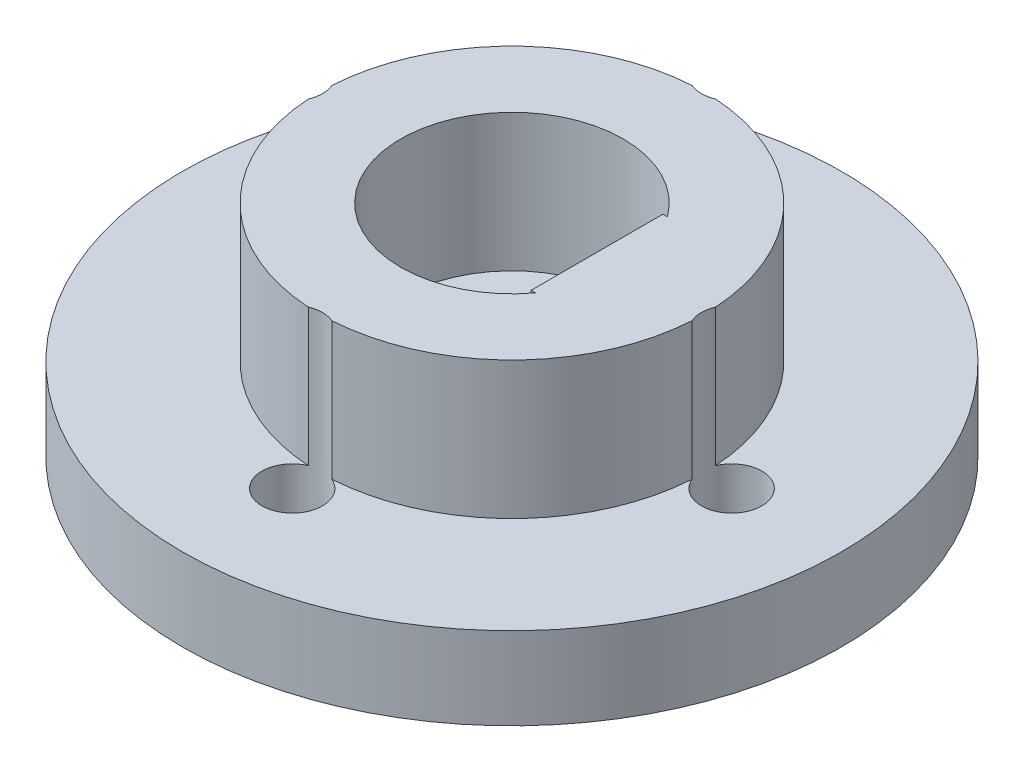
ISO-10303-21;
HEADER;
FILE_DESCRIPTION(('STEP AP214'),'2;1');
FILE_NAME('part.step','',(''),(''),'','','');
FILE_SCHEMA(('AUTOMOTIVE_DESIGN { 1 0 10303 214 1 1 1 1 }'));
ENDSEC;
DATA;
#1=APPLICATION_CONTEXT('core data for automotive mechanical design processes');
#2=APPLICATION_PROTOCOL_DEFINITION('international standard','automotive_design',2000,#1);
#3=PRODUCT_CONTEXT('',#1,'mechanical');
#4=PRODUCT('Part','Part','',(#3));
#5=PRODUCT_RELATED_PRODUCT_CATEGORY('part','',(#4));
#6=PRODUCT_DEFINITION_FORMATION('','',#4);
#7=PRODUCT_DEFINITION_CONTEXT('part definition',#1,'design');
#8=PRODUCT_DEFINITION('design','',#6,#7);
#9=PRODUCT_DEFINITION_SHAPE('','',#8);
#10=(LENGTH_UNIT() NAMED_UNIT(*) SI_UNIT(.MILLI.,.METRE.));
#11=(NAMED_UNIT(*) PLANE_ANGLE_UNIT() SI_UNIT($,.RADIAN.));
#12=(NAMED_UNIT(*) SI_UNIT($,.STERADIAN.) SOLID_ANGLE_UNIT());
#13=UNCERTAINTY_MEASURE_WITH_UNIT(LENGTH_MEASURE(1.E-05),#10,'distance_accuracy_value','');
#14=(GEOMETRIC_REPRESENTATION_CONTEXT(3) GLOBAL_UNCERTAINTY_ASSIGNED_CONTEXT((#13)) GLOBAL_UNIT_ASSIGNED_CONTEXT((#10,
#11,#12)) REPRESENTATION_CONTEXT('',''));
#15=CARTESIAN_POINT('',(0.,0.,0.));
#16=DIRECTION('',(0.,0.,1.));
#17=DIRECTION('',(1.,0.,0.));
#18=AXIS2_PLACEMENT_3D('',#15,#16,#17);
#19=CARTESIAN_POINT('',(0.,48.,0.));
#20=DIRECTION('',(0.,1.,0.));
#21=DIRECTION('',(0.,0.,1.));
#22=AXIS2_PLACEMENT_3D('',#19,#20,#21);
#23=PLANE('',#22);
#24=CARTESIAN_POINT('',(0.,48.,0.));
#25=DIRECTION('',(0.,1.,0.));
#26=DIRECTION('',(0.,0.,1.));
#27=AXIS2_PLACEMENT_3D('',#24,#25,#26);
#28=CIRCLE('',#27,4.05);
#29=CARTESIAN_POINT('',(3.26228447563973,48.,-2.4));
#30=VERTEX_POINT('',#29);
#31=CARTESIAN_POINT('',(3.26228447563973,48.,2.4));
#32=VERTEX_POINT('',#31);
#33=EDGE_CURVE('E229',#30,#32,#28,.T.);
#34=ORIENTED_EDGE('',*,*,#33,.F.);
#35=DIRECTION('',(-1.,0.,0.));
#36=VECTOR('',#35,1.);
#37=CARTESIAN_POINT('',(3.1,48.,-2.4));
#38=LINE('',#37,#36);
#39=CARTESIAN_POINT('',(3.1,48.,-2.4));
#40=VERTEX_POINT('',#39);
#41=EDGE_CURVE('E244',#30,#40,#38,.T.);
#42=ORIENTED_EDGE('',*,*,#41,.T.);
#43=DIRECTION('',(0.,0.,1.));
#44=VECTOR('',#43,1.);
#45=CARTESIAN_POINT('',(3.1,48.,2.4));
#46=LINE('',#45,#44);
#47=CARTESIAN_POINT('',(3.1,48.,2.4));
#48=VERTEX_POINT('',#47);
#49=EDGE_CURVE('E247',#40,#48,#46,.T.);
#50=ORIENTED_EDGE('',*,*,#49,.T.);
#51=DIRECTION('',(1.,0.,0.));
#52=VECTOR('',#51,1.);
#53=CARTESIAN_POINT('',(3.1,48.,2.4));
#54=LINE('',#53,#52);
#55=EDGE_CURVE('E256',#48,#32,#54,.T.);
#56=ORIENTED_EDGE('',*,*,#55,.T.);
#57=EDGE_LOOP('',(#34,#42,#50,#56));
#58=FACE_BOUND('',#57,.T.);
#59=CARTESIAN_POINT('',(-8.,48.,0.));
#60=DIRECTION('',(0.,1.,0.));
#61=DIRECTION('',(0.,0.,1.));
#62=AXIS2_PLACEMENT_3D('',#59,#60,#61);
#63=CIRCLE('',#62,1.1);
#64=CARTESIAN_POINT('',(-6.986875,48.,0.428459723165433));
#65=VERTEX_POINT('',#64);
#66=CARTESIAN_POINT('',(-6.986875,48.,-0.428459723165433));
#67=VERTEX_POINT('',#66);
#68=EDGE_CURVE('E214',#65,#67,#63,.T.);
#69=ORIENTED_EDGE('',*,*,#68,.F.);
#70=CARTESIAN_POINT('',(0.,48.,0.));
#71=DIRECTION('',(0.,1.,0.));
#72=DIRECTION('',(0.,0.,1.));
#73=AXIS2_PLACEMENT_3D('',#70,#71,#72);
#74=CIRCLE('',#73,7.);
#75=CARTESIAN_POINT('',(-0.428459723165433,48.,6.986875));
#76=VERTEX_POINT('',#75);
#77=EDGE_CURVE('E170',#65,#76,#74,.T.);
#78=ORIENTED_EDGE('',*,*,#77,.T.);
#79=CARTESIAN_POINT('',(0.,48.,8.));
#80=DIRECTION('',(0.,1.,0.));
#81=DIRECTION('',(0.,0.,1.));
#82=AXIS2_PLACEMENT_3D('',#79,#80,#81);
#83=CIRCLE('',#82,1.1);
#84=CARTESIAN_POINT('',(0.428459723165433,48.,6.986875));
#85=VERTEX_POINT('',#84);
#86=EDGE_CURVE('E141',#85,#76,#83,.T.);
#87=ORIENTED_EDGE('',*,*,#86,.F.);
#88=CARTESIAN_POINT('',(6.986875,48.,0.428459723165433));
#89=VERTEX_POINT('',#88);
#90=EDGE_CURVE('E161',#85,#89,#74,.T.);
#91=ORIENTED_EDGE('',*,*,#90,.T.);
#92=CARTESIAN_POINT('',(8.,48.,0.));
#93=DIRECTION('',(0.,1.,0.));
#94=DIRECTION('',(0.,0.,1.));
#95=AXIS2_PLACEMENT_3D('',#92,#93,#94);
#96=CIRCLE('',#95,1.1);
#97=CARTESIAN_POINT('',(6.986875,48.,-0.428459723165433));
#98=VERTEX_POINT('',#97);
#99=EDGE_CURVE('E157',#98,#89,#96,.T.);
#100=ORIENTED_EDGE('',*,*,#99,.F.);
#101=CARTESIAN_POINT('',(0.428459723165433,48.,-6.986875));
#102=VERTEX_POINT('',#101);
#103=EDGE_CURVE('E147',#98,#102,#74,.T.);
#104=ORIENTED_EDGE('',*,*,#103,.T.);
#105=CARTESIAN_POINT('',(0.,48.,-8.));
#106=DIRECTION('',(0.,1.,0.));
#107=DIRECTION('',(0.,0.,1.));
#108=AXIS2_PLACEMENT_3D('',#105,#106,#107);
#109=CIRCLE('',#108,1.1);
#110=CARTESIAN_POINT('',(-0.428459723165433,48.,-6.986875));
#111=VERTEX_POINT('',#110);
#112=EDGE_CURVE('E135',#111,#102,#109,.T.);
#113=ORIENTED_EDGE('',*,*,#112,.F.);
#114=EDGE_CURVE('E165',#111,#67,#74,.T.);
#115=ORIENTED_EDGE('',*,*,#114,.T.);
#116=EDGE_LOOP('',(#69,#78,#87,#91,#100,#104,#113,#115));
#117=FACE_BOUND('',#116,.T.);
#118=ADVANCED_FACE('F44',(#58,#117),#23,.T.);
#119=CARTESIAN_POINT('',(0.,48.,0.));
#120=DIRECTION('',(0.,-1.,0.));
#121=DIRECTION('',(0.,0.,-1.));
#122=AXIS2_PLACEMENT_3D('',#119,#120,#121);
#123=CYLINDRICAL_SURFACE('',#122,7.);
#124=DIRECTION('',(0.,-1.,0.));
#125=VECTOR('',#124,1.);
#126=CARTESIAN_POINT('',(-6.986875,43.5,-0.428459723165437));
#127=LINE('',#126,#125);
#128=CARTESIAN_POINT('',(-6.986875,43.,-0.428459723165438));
#129=VERTEX_POINT('',#128);
#130=EDGE_CURVE('E11',#67,#129,#127,.T.);
#131=ORIENTED_EDGE('',*,*,#130,.F.);
#132=ORIENTED_EDGE('',*,*,#114,.F.);
#133=DIRECTION('',(0.,-1.,0.));
#134=VECTOR('',#133,1.);
#135=CARTESIAN_POINT('',(-0.428459723165437,43.5,-6.986875));
#136=LINE('',#135,#134);
#137=CARTESIAN_POINT('',(-0.42845972316544,43.,-6.986875));
#138=VERTEX_POINT('',#137);
#139=EDGE_CURVE('E137',#138,#111,#136,.F.);
#140=ORIENTED_EDGE('',*,*,#139,.F.);
#141=CARTESIAN_POINT('',(0.,43.,0.));
#142=DIRECTION('',(0.,1.,0.));
#143=DIRECTION('',(0.,0.,1.));
#144=AXIS2_PLACEMENT_3D('',#141,#142,#143);
#145=CIRCLE('',#144,7.);
#146=EDGE_CURVE('E315',#138,#129,#145,.T.);
#147=ORIENTED_EDGE('',*,*,#146,.T.);
#148=EDGE_LOOP('',(#131,#132,#140,#147));
#149=FACE_BOUND('',#148,.T.);
#150=ADVANCED_FACE('F320',(#149),#123,.T.);
#151=DIRECTION('',(0.,-1.,0.));
#152=VECTOR('',#151,1.);
#153=CARTESIAN_POINT('',(-6.986875,43.5,0.428459723165437));
#154=LINE('',#153,#152);
#155=CARTESIAN_POINT('',(-6.986875,43.,0.42845972316544));
#156=VERTEX_POINT('',#155);
#157=EDGE_CURVE('E53',#156,#65,#154,.F.);
#158=ORIENTED_EDGE('',*,*,#157,.F.);
#159=CARTESIAN_POINT('',(-0.428459723165438,43.,6.986875));
#160=VERTEX_POINT('',#159);
#161=EDGE_CURVE('E177',#156,#160,#145,.T.);
#162=ORIENTED_EDGE('',*,*,#161,.T.);
#163=DIRECTION('',(0.,-1.,0.));
#164=VECTOR('',#163,1.);
#165=CARTESIAN_POINT('',(-0.428459723165437,43.5,6.986875));
#166=LINE('',#165,#164);
#167=EDGE_CURVE('E204',#76,#160,#166,.T.);
#168=ORIENTED_EDGE('',*,*,#167,.F.);
#169=ORIENTED_EDGE('',*,*,#77,.F.);
#170=EDGE_LOOP('',(#158,#162,#168,#169));
#171=FACE_BOUND('',#170,.T.);
#172=ADVANCED_FACE('F227',(#171),#123,.T.);
#173=DIRECTION('',(0.,-1.,0.));
#174=VECTOR('',#173,1.);
#175=CARTESIAN_POINT('',(6.986875,43.5,0.428459723165437));
#176=LINE('',#175,#174);
#177=CARTESIAN_POINT('',(6.986875,43.,0.428459723165438));
#178=VERTEX_POINT('',#177);
#179=EDGE_CURVE('E209',#89,#178,#176,.T.);
#180=ORIENTED_EDGE('',*,*,#179,.F.);
#181=ORIENTED_EDGE('',*,*,#90,.F.);
#182=DIRECTION('',(0.,-1.,0.));
#183=VECTOR('',#182,1.);
#184=CARTESIAN_POINT('',(0.428459723165437,43.5,6.986875));
#185=LINE('',#184,#183);
#186=CARTESIAN_POINT('',(0.428459723165436,43.,6.986875));
#187=VERTEX_POINT('',#186);
#188=EDGE_CURVE('E152',#187,#85,#185,.F.);
#189=ORIENTED_EDGE('',*,*,#188,.F.);
#190=EDGE_CURVE('E175',#187,#178,#145,.T.);
#191=ORIENTED_EDGE('',*,*,#190,.T.);
#192=EDGE_LOOP('',(#180,#181,#189,#191));
#193=FACE_BOUND('',#192,.T.);
#194=ADVANCED_FACE('F301',(#193),#123,.T.);
#195=DIRECTION('',(0.,-1.,0.));
#196=VECTOR('',#195,1.);
#197=CARTESIAN_POINT('',(6.986875,43.5,-0.428459723165437));
#198=LINE('',#197,#196);
#199=CARTESIAN_POINT('',(6.986875,43.,-0.428459723165437));
#200=VERTEX_POINT('',#199);
#201=EDGE_CURVE('E210',#200,#98,#198,.F.);
#202=ORIENTED_EDGE('',*,*,#201,.F.);
#203=CARTESIAN_POINT('',(0.428459723165438,43.,-6.986875));
#204=VERTEX_POINT('',#203);
#205=EDGE_CURVE('E155',#200,#204,#145,.T.);
#206=ORIENTED_EDGE('',*,*,#205,.T.);
#207=DIRECTION('',(0.,-1.,0.));
#208=VECTOR('',#207,1.);
#209=CARTESIAN_POINT('',(0.428459723165437,43.5,-6.986875));
#210=LINE('',#209,#208);
#211=EDGE_CURVE('E136',#102,#204,#210,.T.);
#212=ORIENTED_EDGE('',*,*,#211,.F.);
#213=ORIENTED_EDGE('',*,*,#103,.F.);
#214=EDGE_LOOP('',(#202,#206,#212,#213));
#215=FACE_BOUND('',#214,.T.);
#216=ADVANCED_FACE('F149',(#215),#123,.T.);
#217=CARTESIAN_POINT('',(0.,48.,0.));
#218=DIRECTION('',(0.,-1.,0.));
#219=DIRECTION('',(0.,0.,-1.));
#220=AXIS2_PLACEMENT_3D('',#217,#218,#219);
#221=CYLINDRICAL_SURFACE('',#220,4.05);
#222=ORIENTED_EDGE('',*,*,#33,.T.);
#223=DIRECTION('',(0.,-1.,0.));
#224=VECTOR('',#223,1.);
#225=CARTESIAN_POINT('',(3.26228447563973,48.,2.4));
#226=LINE('',#225,#224);
#227=CARTESIAN_POINT('',(3.26228447563973,43.,2.4));
#228=VERTEX_POINT('',#227);
#229=EDGE_CURVE('E198',#32,#228,#226,.T.);
#230=ORIENTED_EDGE('',*,*,#229,.T.);
#231=CARTESIAN_POINT('',(0.,43.,0.));
#232=DIRECTION('',(0.,1.,0.));
#233=DIRECTION('',(0.,0.,1.));
#234=AXIS2_PLACEMENT_3D('',#231,#232,#233);
#235=CIRCLE('',#234,4.05);
#236=CARTESIAN_POINT('',(3.26228447563973,43.,-2.4));
#237=VERTEX_POINT('',#236);
#238=EDGE_CURVE('E168',#237,#228,#235,.T.);
#239=ORIENTED_EDGE('',*,*,#238,.F.);
#240=DIRECTION('',(0.,-1.,0.));
#241=VECTOR('',#240,1.);
#242=CARTESIAN_POINT('',(3.26228447563973,48.,-2.4));
#243=LINE('',#242,#241);
#244=EDGE_CURVE('E176',#237,#30,#243,.F.);
#245=ORIENTED_EDGE('',*,*,#244,.T.);
#246=EDGE_LOOP('',(#222,#230,#239,#245));
#247=FACE_BOUND('',#246,.T.);
#248=ADVANCED_FACE('F327',(#247),#221,.F.);
#249=CARTESIAN_POINT('',(0.,43.,0.));
#250=DIRECTION('',(0.,1.,0.));
#251=DIRECTION('',(0.,0.,1.));
#252=AXIS2_PLACEMENT_3D('',#249,#250,#251);
#253=PLANE('',#252);
#254=DIRECTION('',(-1.,0.,0.));
#255=VECTOR('',#254,1.);
#256=CARTESIAN_POINT('',(3.1,43.,-2.4));
#257=LINE('',#256,#255);
#258=CARTESIAN_POINT('',(3.1,43.,-2.4));
#259=VERTEX_POINT('',#258);
#260=EDGE_CURVE('E241',#237,#259,#257,.T.);
#261=ORIENTED_EDGE('',*,*,#260,.F.);
#262=ORIENTED_EDGE('',*,*,#238,.T.);
#263=DIRECTION('',(1.,0.,0.));
#264=VECTOR('',#263,1.);
#265=CARTESIAN_POINT('',(3.1,43.,2.4));
#266=LINE('',#265,#264);
#267=CARTESIAN_POINT('',(3.1,43.,2.4));
#268=VERTEX_POINT('',#267);
#269=EDGE_CURVE('E249',#268,#228,#266,.T.);
#270=ORIENTED_EDGE('',*,*,#269,.F.);
#271=DIRECTION('',(0.,0.,1.));
#272=VECTOR('',#271,1.);
#273=CARTESIAN_POINT('',(3.1,43.,2.4));
#274=LINE('',#273,#272);
#275=EDGE_CURVE('E253',#259,#268,#274,.T.);
#276=ORIENTED_EDGE('',*,*,#275,.F.);
#277=EDGE_LOOP('',(#261,#262,#270,#276));
#278=FACE_BOUND('',#277,.T.);
#279=CARTESIAN_POINT('',(0.,43.,0.));
#280=DIRECTION('',(0.,1.,0.));
#281=DIRECTION('',(0.,0.,1.));
#282=AXIS2_PLACEMENT_3D('',#279,#280,#281);
#283=CIRCLE('',#282,1.75);
#284=CARTESIAN_POINT('',(0.,43.,1.75));
#285=VERTEX_POINT('',#284);
#286=EDGE_CURVE('E179',#285,#285,#283,.T.);
#287=ORIENTED_EDGE('',*,*,#286,.F.);
#288=EDGE_LOOP('',(#287));
#289=FACE_BOUND('',#288,.T.);
#290=ADVANCED_FACE('F331',(#278,#289),#253,.T.);
#291=ORIENTED_EDGE('',*,*,#161,.F.);
#292=CARTESIAN_POINT('',(-8.,43.,0.));
#293=DIRECTION('',(0.,1.,0.));
#294=DIRECTION('',(0.,0.,1.));
#295=AXIS2_PLACEMENT_3D('',#292,#293,#294);
#296=CIRCLE('',#295,1.1);
#297=EDGE_CURVE('E58',#156,#129,#296,.F.);
#298=ORIENTED_EDGE('',*,*,#297,.T.);
#299=ORIENTED_EDGE('',*,*,#146,.F.);
#300=CARTESIAN_POINT('',(0.,43.,-8.));
#301=DIRECTION('',(0.,1.,0.));
#302=DIRECTION('',(0.,0.,1.));
#303=AXIS2_PLACEMENT_3D('',#300,#301,#302);
#304=CIRCLE('',#303,1.1);
#305=EDGE_CURVE('E69',#138,#204,#304,.F.);
#306=ORIENTED_EDGE('',*,*,#305,.T.);
#307=ORIENTED_EDGE('',*,*,#205,.F.);
#308=CARTESIAN_POINT('',(8.,43.,0.));
#309=DIRECTION('',(0.,1.,0.));
#310=DIRECTION('',(0.,0.,1.));
#311=AXIS2_PLACEMENT_3D('',#308,#309,#310);
#312=CIRCLE('',#311,1.1);
#313=EDGE_CURVE('E273',#200,#178,#312,.F.);
#314=ORIENTED_EDGE('',*,*,#313,.T.);
#315=ORIENTED_EDGE('',*,*,#190,.F.);
#316=CARTESIAN_POINT('',(0.,43.,8.));
#317=DIRECTION('',(0.,1.,0.));
#318=DIRECTION('',(0.,0.,1.));
#319=AXIS2_PLACEMENT_3D('',#316,#317,#318);
#320=CIRCLE('',#319,1.1);
#321=EDGE_CURVE('E285',#187,#160,#320,.F.);
#322=ORIENTED_EDGE('',*,*,#321,.T.);
#323=EDGE_LOOP('',(#291,#298,#299,#306,#307,#314,#315,#322));
#324=FACE_BOUND('',#323,.T.);
#325=CARTESIAN_POINT('',(0.,43.,0.));
#326=DIRECTION('',(0.,1.,0.));
#327=DIRECTION('',(0.,0.,1.));
#328=AXIS2_PLACEMENT_3D('',#325,#326,#327);
#329=CIRCLE('',#328,12.);
#330=CARTESIAN_POINT('',(0.,43.,12.));
#331=VERTEX_POINT('',#330);
#332=EDGE_CURVE('E187',#331,#331,#329,.T.);
#333=ORIENTED_EDGE('',*,*,#332,.T.);
#334=EDGE_LOOP('',(#333));
#335=FACE_BOUND('',#334,.T.);
#336=ADVANCED_FACE('F306',(#324,#335),#253,.T.);
#337=CARTESIAN_POINT('',(0.,40.,0.));
#338=DIRECTION('',(0.,1.,0.));
#339=DIRECTION('',(0.,0.,1.));
#340=AXIS2_PLACEMENT_3D('',#337,#338,#339);
#341=PLANE('',#340);
#342=CARTESIAN_POINT('',(-8.,40.,0.));
#343=DIRECTION('',(0.,1.,0.));
#344=DIRECTION('',(0.,0.,1.));
#345=AXIS2_PLACEMENT_3D('',#342,#343,#344);
#346=CIRCLE('',#345,1.1);
#347=CARTESIAN_POINT('',(-8.,40.,1.1));
#348=VERTEX_POINT('',#347);
#349=EDGE_CURVE('E254',#348,#348,#346,.F.);
#350=ORIENTED_EDGE('',*,*,#349,.F.);
#351=EDGE_LOOP('',(#350));
#352=FACE_BOUND('',#351,.T.);
#353=CARTESIAN_POINT('',(8.,40.,0.));
#354=DIRECTION('',(0.,1.,0.));
#355=DIRECTION('',(0.,0.,1.));
#356=AXIS2_PLACEMENT_3D('',#353,#354,#355);
#357=CIRCLE('',#356,1.1);
#358=CARTESIAN_POINT('',(8.,40.,1.1));
#359=VERTEX_POINT('',#358);
#360=EDGE_CURVE('E269',#359,#359,#357,.F.);
#361=ORIENTED_EDGE('',*,*,#360,.F.);
#362=EDGE_LOOP('',(#361));
#363=FACE_BOUND('',#362,.T.);
#364=CARTESIAN_POINT('',(0.,40.,8.));
#365=DIRECTION('',(0.,1.,0.));
#366=DIRECTION('',(0.,0.,1.));
#367=AXIS2_PLACEMENT_3D('',#364,#365,#366);
#368=CIRCLE('',#367,1.1);
#369=CARTESIAN_POINT('',(0.,40.,9.1));
#370=VERTEX_POINT('',#369);
#371=EDGE_CURVE('E279',#370,#370,#368,.F.);
#372=ORIENTED_EDGE('',*,*,#371,.F.);
#373=EDGE_LOOP('',(#372));
#374=FACE_BOUND('',#373,.T.);
#375=CARTESIAN_POINT('',(0.,40.,-8.));
#376=DIRECTION('',(0.,1.,0.));
#377=DIRECTION('',(0.,0.,1.));
#378=AXIS2_PLACEMENT_3D('',#375,#376,#377);
#379=CIRCLE('',#378,1.1);
#380=CARTESIAN_POINT('',(0.,40.,-6.9));
#381=VERTEX_POINT('',#380);
#382=EDGE_CURVE('E286',#381,#381,#379,.F.);
#383=ORIENTED_EDGE('',*,*,#382,.F.);
#384=EDGE_LOOP('',(#383));
#385=FACE_BOUND('',#384,.T.);
#386=CARTESIAN_POINT('',(0.,40.,0.));
#387=DIRECTION('',(0.,1.,0.));
#388=DIRECTION('',(0.,0.,1.));
#389=AXIS2_PLACEMENT_3D('',#386,#387,#388);
#390=CIRCLE('',#389,12.);
#391=CARTESIAN_POINT('',(0.,40.,12.));
#392=VERTEX_POINT('',#391);
#393=EDGE_CURVE('E185',#392,#392,#390,.T.);
#394=ORIENTED_EDGE('',*,*,#393,.F.);
#395=EDGE_LOOP('',(#394));
#396=FACE_BOUND('',#395,.T.);
#397=CARTESIAN_POINT('',(0.,40.,0.));
#398=DIRECTION('',(0.,1.,0.));
#399=DIRECTION('',(0.,0.,1.));
#400=AXIS2_PLACEMENT_3D('',#397,#398,#399);
#401=CIRCLE('',#400,1.75);
#402=CARTESIAN_POINT('',(0.,40.,1.75));
#403=VERTEX_POINT('',#402);
#404=EDGE_CURVE('E167',#403,#403,#401,.T.);
#405=ORIENTED_EDGE('',*,*,#404,.T.);
#406=EDGE_LOOP('',(#405));
#407=FACE_BOUND('',#406,.T.);
#408=ADVANCED_FACE('F388',(#352,#363,#374,#385,#396,#407),#341,.F.);
#409=CARTESIAN_POINT('',(0.,43.,0.));
#410=DIRECTION('',(0.,-1.,0.));
#411=DIRECTION('',(0.,0.,-1.));
#412=AXIS2_PLACEMENT_3D('',#409,#410,#411);
#413=CYLINDRICAL_SURFACE('',#412,12.);
#414=ORIENTED_EDGE('',*,*,#332,.F.);
#415=EDGE_LOOP('',(#414));
#416=FACE_BOUND('',#415,.T.);
#417=ORIENTED_EDGE('',*,*,#393,.T.);
#418=EDGE_LOOP('',(#417));
#419=FACE_BOUND('',#418,.T.);
#420=ADVANCED_FACE('F50',(#416,#419),#413,.T.);
#421=CARTESIAN_POINT('',(0.,43.,0.));
#422=DIRECTION('',(0.,-1.,0.));
#423=DIRECTION('',(0.,0.,-1.));
#424=AXIS2_PLACEMENT_3D('',#421,#422,#423);
#425=CYLINDRICAL_SURFACE('',#424,1.75);
#426=ORIENTED_EDGE('',*,*,#286,.T.);
#427=EDGE_LOOP('',(#426));
#428=FACE_BOUND('',#427,.T.);
#429=ORIENTED_EDGE('',*,*,#404,.F.);
#430=EDGE_LOOP('',(#429));
#431=FACE_BOUND('',#430,.T.);
#432=ADVANCED_FACE('F408',(#428,#431),#425,.F.);
#433=CARTESIAN_POINT('',(3.1,48.,2.4));
#434=DIRECTION('',(1.,0.,0.));
#435=DIRECTION('',(0.,0.,-1.));
#436=AXIS2_PLACEMENT_3D('',#433,#434,#435);
#437=PLANE('',#436);
#438=ORIENTED_EDGE('',*,*,#275,.T.);
#439=DIRECTION('',(0.,-1.,0.));
#440=VECTOR('',#439,1.);
#441=CARTESIAN_POINT('',(3.1,48.,2.4));
#442=LINE('',#441,#440);
#443=EDGE_CURVE('E235',#48,#268,#442,.T.);
#444=ORIENTED_EDGE('',*,*,#443,.F.);
#445=ORIENTED_EDGE('',*,*,#49,.F.);
#446=DIRECTION('',(0.,-1.,0.));
#447=VECTOR('',#446,1.);
#448=CARTESIAN_POINT('',(3.1,48.,-2.4));
#449=LINE('',#448,#447);
#450=EDGE_CURVE('E239',#40,#259,#449,.T.);
#451=ORIENTED_EDGE('',*,*,#450,.T.);
#452=EDGE_LOOP('',(#438,#444,#445,#451));
#453=FACE_BOUND('',#452,.T.);
#454=ADVANCED_FACE('F416',(#453),#437,.F.);
#455=CARTESIAN_POINT('',(3.1,48.,2.4));
#456=DIRECTION('',(0.,0.,-1.));
#457=DIRECTION('',(-1.,0.,0.));
#458=AXIS2_PLACEMENT_3D('',#455,#456,#457);
#459=PLANE('',#458);
#460=ORIENTED_EDGE('',*,*,#229,.F.);
#461=ORIENTED_EDGE('',*,*,#55,.F.);
#462=ORIENTED_EDGE('',*,*,#443,.T.);
#463=ORIENTED_EDGE('',*,*,#269,.T.);
#464=EDGE_LOOP('',(#460,#461,#462,#463));
#465=FACE_BOUND('',#464,.T.);
#466=ADVANCED_FACE('F439',(#465),#459,.F.);
#467=CARTESIAN_POINT('',(3.1,48.,-2.4));
#468=DIRECTION('',(0.,0.,1.));
#469=DIRECTION('',(1.,0.,0.));
#470=AXIS2_PLACEMENT_3D('',#467,#468,#469);
#471=PLANE('',#470);
#472=ORIENTED_EDGE('',*,*,#244,.F.);
#473=ORIENTED_EDGE('',*,*,#260,.T.);
#474=ORIENTED_EDGE('',*,*,#450,.F.);
#475=ORIENTED_EDGE('',*,*,#41,.F.);
#476=EDGE_LOOP('',(#472,#473,#474,#475));
#477=FACE_BOUND('',#476,.T.);
#478=ADVANCED_FACE('F363',(#477),#471,.F.);
#479=CARTESIAN_POINT('',(0.,48.,-8.));
#480=DIRECTION('',(0.,-1.,0.));
#481=DIRECTION('',(0.,0.,-1.));
#482=AXIS2_PLACEMENT_3D('',#479,#480,#481);
#483=CYLINDRICAL_SURFACE('',#482,1.1);
#484=ORIENTED_EDGE('',*,*,#211,.T.);
#485=ORIENTED_EDGE('',*,*,#305,.F.);
#486=ORIENTED_EDGE('',*,*,#139,.T.);
#487=ORIENTED_EDGE('',*,*,#112,.T.);
#488=EDGE_LOOP('',(#484,#485,#486,#487));
#489=FACE_BOUND('',#488,.T.);
#490=ORIENTED_EDGE('',*,*,#382,.T.);
#491=EDGE_LOOP('',(#490));
#492=FACE_BOUND('',#491,.T.);
#493=ADVANCED_FACE('F131',(#489,#492),#483,.F.);
#494=CARTESIAN_POINT('',(0.,48.,8.));
#495=DIRECTION('',(0.,-1.,0.));
#496=DIRECTION('',(0.,0.,-1.));
#497=AXIS2_PLACEMENT_3D('',#494,#495,#496);
#498=CYLINDRICAL_SURFACE('',#497,1.1);
#499=ORIENTED_EDGE('',*,*,#167,.T.);
#500=ORIENTED_EDGE('',*,*,#321,.F.);
#501=ORIENTED_EDGE('',*,*,#188,.T.);
#502=ORIENTED_EDGE('',*,*,#86,.T.);
#503=EDGE_LOOP('',(#499,#500,#501,#502));
#504=FACE_BOUND('',#503,.T.);
#505=ORIENTED_EDGE('',*,*,#371,.T.);
#506=EDGE_LOOP('',(#505));
#507=FACE_BOUND('',#506,.T.);
#508=ADVANCED_FACE('F305',(#504,#507),#498,.F.);
#509=CARTESIAN_POINT('',(8.,48.,0.));
#510=DIRECTION('',(0.,-1.,0.));
#511=DIRECTION('',(0.,0.,-1.));
#512=AXIS2_PLACEMENT_3D('',#509,#510,#511);
#513=CYLINDRICAL_SURFACE('',#512,1.1);
#514=ORIENTED_EDGE('',*,*,#179,.T.);
#515=ORIENTED_EDGE('',*,*,#313,.F.);
#516=ORIENTED_EDGE('',*,*,#201,.T.);
#517=ORIENTED_EDGE('',*,*,#99,.T.);
#518=EDGE_LOOP('',(#514,#515,#516,#517));
#519=FACE_BOUND('',#518,.T.);
#520=ORIENTED_EDGE('',*,*,#360,.T.);
#521=EDGE_LOOP('',(#520));
#522=FACE_BOUND('',#521,.T.);
#523=ADVANCED_FACE('F300',(#519,#522),#513,.F.);
#524=CARTESIAN_POINT('',(-8.,48.,0.));
#525=DIRECTION('',(0.,-1.,0.));
#526=DIRECTION('',(0.,0.,-1.));
#527=AXIS2_PLACEMENT_3D('',#524,#525,#526);
#528=CYLINDRICAL_SURFACE('',#527,1.1);
#529=ORIENTED_EDGE('',*,*,#130,.T.);
#530=ORIENTED_EDGE('',*,*,#297,.F.);
#531=ORIENTED_EDGE('',*,*,#157,.T.);
#532=ORIENTED_EDGE('',*,*,#68,.T.);
#533=EDGE_LOOP('',(#529,#530,#531,#532));
#534=FACE_BOUND('',#533,.T.);
#535=ORIENTED_EDGE('',*,*,#349,.T.);
#536=EDGE_LOOP('',(#535));
#537=FACE_BOUND('',#536,.T.);
#538=ADVANCED_FACE('F213',(#534,#537),#528,.F.);
#539=CLOSED_SHELL('',(#118,#150,#172,#194,#216,#248,#290,#336,#408,#420,#432,#454,#466,#478,
#493,#508,#523,#538));
#540=MANIFOLD_SOLID_BREP('B2',#539);
#541=ADVANCED_BREP_SHAPE_REPRESENTATION('',(#18,#540),#14);
#542=SHAPE_DEFINITION_REPRESENTATION(#9,#541);
ENDSEC;
END-ISO-10303-21;
